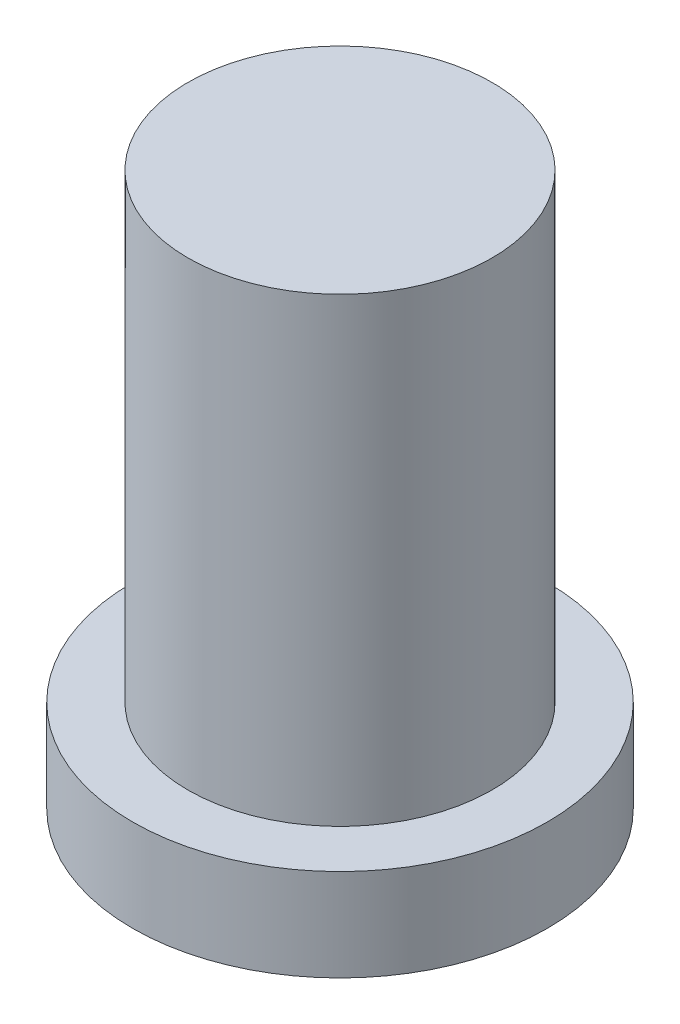
ISO-10303-21;
HEADER;
FILE_DESCRIPTION(('STEP AP214'),'2;1');
FILE_NAME('part.step','',(''),(''),'','','');
FILE_SCHEMA(('AUTOMOTIVE_DESIGN { 1 0 10303 214 1 1 1 1 }'));
ENDSEC;
DATA;
#1=APPLICATION_CONTEXT('core data for automotive mechanical design processes');
#2=APPLICATION_PROTOCOL_DEFINITION('international standard','automotive_design',2000,#1);
#3=PRODUCT_CONTEXT('',#1,'mechanical');
#4=PRODUCT('Part','Part','',(#3));
#5=PRODUCT_RELATED_PRODUCT_CATEGORY('part','',(#4));
#6=PRODUCT_DEFINITION_FORMATION('','',#4);
#7=PRODUCT_DEFINITION_CONTEXT('part definition',#1,'design');
#8=PRODUCT_DEFINITION('design','',#6,#7);
#9=PRODUCT_DEFINITION_SHAPE('','',#8);
#10=(LENGTH_UNIT() NAMED_UNIT(*) SI_UNIT(.MILLI.,.METRE.));
#11=(NAMED_UNIT(*) PLANE_ANGLE_UNIT() SI_UNIT($,.RADIAN.));
#12=(NAMED_UNIT(*) SI_UNIT($,.STERADIAN.) SOLID_ANGLE_UNIT());
#13=UNCERTAINTY_MEASURE_WITH_UNIT(LENGTH_MEASURE(1.E-05),#10,'distance_accuracy_value','');
#14=(GEOMETRIC_REPRESENTATION_CONTEXT(3) GLOBAL_UNCERTAINTY_ASSIGNED_CONTEXT((#13)) GLOBAL_UNIT_ASSIGNED_CONTEXT((#10,
#11,#12)) REPRESENTATION_CONTEXT('',''));
#15=CARTESIAN_POINT('',(0.,0.,0.));
#16=DIRECTION('',(0.,0.,1.));
#17=DIRECTION('',(1.,0.,0.));
#18=AXIS2_PLACEMENT_3D('',#15,#16,#17);
#19=CARTESIAN_POINT('',(0.,12.,0.));
#20=DIRECTION('',(0.,-1.,0.));
#21=DIRECTION('',(0.,0.,-1.));
#22=AXIS2_PLACEMENT_3D('',#19,#20,#21);
#23=CYLINDRICAL_SURFACE('',#22,3.3);
#24=CARTESIAN_POINT('',(0.,2.,0.));
#25=DIRECTION('',(0.,1.,0.));
#26=DIRECTION('',(0.,0.,1.));
#27=AXIS2_PLACEMENT_3D('',#24,#25,#26);
#28=CIRCLE('',#27,3.3);
#29=CARTESIAN_POINT('',(0.,2.,3.3));
#30=VERTEX_POINT('',#29);
#31=EDGE_CURVE('E48',#30,#30,#28,.T.);
#32=ORIENTED_EDGE('',*,*,#31,.T.);
#33=EDGE_LOOP('',(#32));
#34=FACE_BOUND('',#33,.T.);
#35=CARTESIAN_POINT('',(0.,12.,0.));
#36=DIRECTION('',(0.,1.,0.));
#37=DIRECTION('',(0.,0.,1.));
#38=AXIS2_PLACEMENT_3D('',#35,#36,#37);
#39=CIRCLE('',#38,3.3);
#40=CARTESIAN_POINT('',(0.,12.,3.3));
#41=VERTEX_POINT('',#40);
#42=EDGE_CURVE('E10',#41,#41,#39,.T.);
#43=ORIENTED_EDGE('',*,*,#42,.F.);
#44=EDGE_LOOP('',(#43));
#45=FACE_BOUND('',#44,.T.);
#46=ADVANCED_FACE('F33',(#34,#45),#23,.T.);
#47=CARTESIAN_POINT('',(0.,12.,0.));
#48=DIRECTION('',(0.,1.,0.));
#49=DIRECTION('',(0.,0.,1.));
#50=AXIS2_PLACEMENT_3D('',#47,#48,#49);
#51=PLANE('',#50);
#52=ORIENTED_EDGE('',*,*,#42,.T.);
#53=EDGE_LOOP('',(#52));
#54=FACE_BOUND('',#53,.T.);
#55=ADVANCED_FACE('F58',(#54),#51,.T.);
#56=CARTESIAN_POINT('',(0.,2.,0.));
#57=DIRECTION('',(0.,1.,0.));
#58=DIRECTION('',(0.,0.,1.));
#59=AXIS2_PLACEMENT_3D('',#56,#57,#58);
#60=PLANE('',#59);
#61=CARTESIAN_POINT('',(0.,2.,0.));
#62=DIRECTION('',(0.,1.,0.));
#63=DIRECTION('',(0.,0.,1.));
#64=AXIS2_PLACEMENT_3D('',#61,#62,#63);
#65=CIRCLE('',#64,4.5);
#66=CARTESIAN_POINT('',(0.,2.,4.5));
#67=VERTEX_POINT('',#66);
#68=EDGE_CURVE('E39',#67,#67,#65,.T.);
#69=ORIENTED_EDGE('',*,*,#68,.T.);
#70=EDGE_LOOP('',(#69));
#71=FACE_BOUND('',#70,.T.);
#72=ORIENTED_EDGE('',*,*,#31,.F.);
#73=EDGE_LOOP('',(#72));
#74=FACE_BOUND('',#73,.T.);
#75=ADVANCED_FACE('F55',(#71,#74),#60,.T.);
#76=CARTESIAN_POINT('',(0.,2.,0.));
#77=DIRECTION('',(0.,-1.,0.));
#78=DIRECTION('',(0.,0.,-1.));
#79=AXIS2_PLACEMENT_3D('',#76,#77,#78);
#80=CYLINDRICAL_SURFACE('',#79,4.5);
#81=ORIENTED_EDGE('',*,*,#68,.F.);
#82=EDGE_LOOP('',(#81));
#83=FACE_BOUND('',#82,.T.);
#84=CARTESIAN_POINT('',(0.,0.,0.));
#85=DIRECTION('',(0.,1.,0.));
#86=DIRECTION('',(0.,0.,1.));
#87=AXIS2_PLACEMENT_3D('',#84,#85,#86);
#88=CIRCLE('',#87,4.5);
#89=CARTESIAN_POINT('',(0.,0.,4.5));
#90=VERTEX_POINT('',#89);
#91=EDGE_CURVE('E43',#90,#90,#88,.T.);
#92=ORIENTED_EDGE('',*,*,#91,.T.);
#93=EDGE_LOOP('',(#92));
#94=FACE_BOUND('',#93,.T.);
#95=ADVANCED_FACE('F57',(#83,#94),#80,.T.);
#96=CARTESIAN_POINT('',(0.,0.,0.));
#97=DIRECTION('',(0.,1.,0.));
#98=DIRECTION('',(0.,0.,1.));
#99=AXIS2_PLACEMENT_3D('',#96,#97,#98);
#100=PLANE('',#99);
#101=ORIENTED_EDGE('',*,*,#91,.F.);
#102=EDGE_LOOP('',(#101));
#103=FACE_BOUND('',#102,.T.);
#104=ADVANCED_FACE('F64',(#103),#100,.F.);
#105=CLOSED_SHELL('',(#46,#55,#75,#95,#104));
#106=MANIFOLD_SOLID_BREP('B2',#105);
#107=ADVANCED_BREP_SHAPE_REPRESENTATION('',(#18,#106),#14);
#108=SHAPE_DEFINITION_REPRESENTATION(#9,#107);
ENDSEC;
END-ISO-10303-21;
